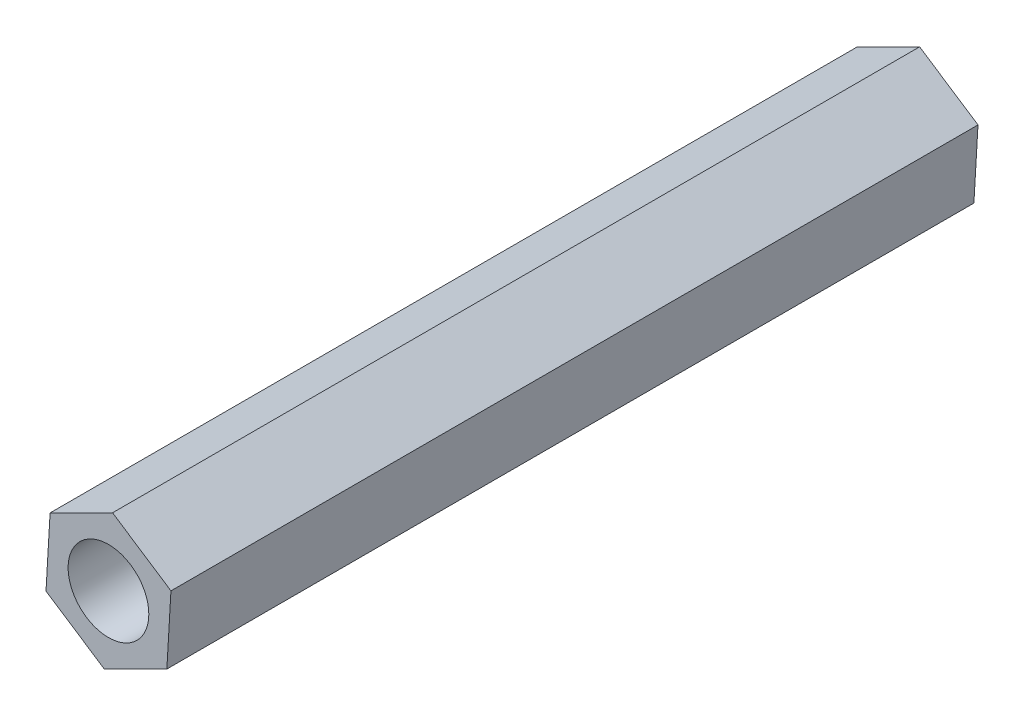
ISO-10303-21;
HEADER;
FILE_DESCRIPTION(('STEP AP214'),'2;1');
FILE_NAME('part.step','',(''),(''),'','','');
FILE_SCHEMA(('AUTOMOTIVE_DESIGN { 1 0 10303 214 1 1 1 1 }'));
ENDSEC;
DATA;
#1=APPLICATION_CONTEXT('core data for automotive mechanical design processes');
#2=APPLICATION_PROTOCOL_DEFINITION('international standard','automotive_design',2000,#1);
#3=PRODUCT_CONTEXT('',#1,'mechanical');
#4=PRODUCT('Part','Part','',(#3));
#5=PRODUCT_RELATED_PRODUCT_CATEGORY('part','',(#4));
#6=PRODUCT_DEFINITION_FORMATION('','',#4);
#7=PRODUCT_DEFINITION_CONTEXT('part definition',#1,'design');
#8=PRODUCT_DEFINITION('design','',#6,#7);
#9=PRODUCT_DEFINITION_SHAPE('','',#8);
#10=(LENGTH_UNIT() NAMED_UNIT(*) SI_UNIT(.MILLI.,.METRE.));
#11=(NAMED_UNIT(*) PLANE_ANGLE_UNIT() SI_UNIT($,.RADIAN.));
#12=(NAMED_UNIT(*) SI_UNIT($,.STERADIAN.) SOLID_ANGLE_UNIT());
#13=UNCERTAINTY_MEASURE_WITH_UNIT(LENGTH_MEASURE(1.E-05),#10,'distance_accuracy_value','');
#14=(GEOMETRIC_REPRESENTATION_CONTEXT(3) GLOBAL_UNCERTAINTY_ASSIGNED_CONTEXT((#13)) GLOBAL_UNIT_ASSIGNED_CONTEXT((#10,
#11,#12)) REPRESENTATION_CONTEXT('',''));
#15=CARTESIAN_POINT('',(0.,0.,0.));
#16=DIRECTION('',(0.,0.,1.));
#17=DIRECTION('',(1.,0.,0.));
#18=AXIS2_PLACEMENT_3D('',#15,#16,#17);
#19=CARTESIAN_POINT('',(0.,0.,40.));
#20=DIRECTION('',(0.,0.,1.));
#21=DIRECTION('',(1.,0.,0.));
#22=AXIS2_PLACEMENT_3D('',#19,#20,#21);
#23=PLANE('',#22);
#24=DIRECTION('',(0.058656445682659,0.998278228441288,0.));
#25=VECTOR('',#24,1.);
#26=CARTESIAN_POINT('',(2.89323874121007,-1.90503794879813,40.));
#27=LINE('',#26,#25);
#28=CARTESIAN_POINT('',(2.89323874121007,-1.90503794879813,40.));
#29=VERTEX_POINT('',#28);
#30=CARTESIAN_POINT('',(3.09643062943761,1.55309927470217,40.));
#31=VERTEX_POINT('',#30);
#32=EDGE_CURVE('E132',#29,#31,#27,.T.);
#33=ORIENTED_EDGE('',*,*,#32,.T.);
#34=DIRECTION('',(-0.835206083033751,0.549937086277529,0.));
#35=VECTOR('',#34,1.);
#36=CARTESIAN_POINT('',(3.09643062943761,1.55309927470217,40.));
#37=LINE('',#36,#35);
#38=CARTESIAN_POINT('',(0.203191888227539,3.4581372235003,40.));
#39=VERTEX_POINT('',#38);
#40=EDGE_CURVE('E90',#31,#39,#37,.T.);
#41=ORIENTED_EDGE('',*,*,#40,.T.);
#42=DIRECTION('',(-0.89386252871641,-0.448341142163759,0.));
#43=VECTOR('',#42,1.);
#44=CARTESIAN_POINT('',(0.203191888227539,3.4581372235003,40.));
#45=LINE('',#44,#43);
#46=CARTESIAN_POINT('',(-2.89323874121007,1.90503794879813,40.));
#47=VERTEX_POINT('',#46);
#48=EDGE_CURVE('E103',#39,#47,#45,.T.);
#49=ORIENTED_EDGE('',*,*,#48,.T.);
#50=DIRECTION('',(-0.0586564456826592,-0.998278228441288,0.));
#51=VECTOR('',#50,1.);
#52=CARTESIAN_POINT('',(-2.89323874121007,1.90503794879813,40.));
#53=LINE('',#52,#51);
#54=CARTESIAN_POINT('',(-3.09643062943761,-1.55309927470217,40.));
#55=VERTEX_POINT('',#54);
#56=EDGE_CURVE('E97',#47,#55,#53,.T.);
#57=ORIENTED_EDGE('',*,*,#56,.T.);
#58=DIRECTION('',(0.835206083033751,-0.549937086277529,0.));
#59=VECTOR('',#58,1.);
#60=CARTESIAN_POINT('',(-3.09643062943761,-1.55309927470217,40.));
#61=LINE('',#60,#59);
#62=CARTESIAN_POINT('',(-0.203191888227537,-3.4581372235003,40.));
#63=VERTEX_POINT('',#62);
#64=EDGE_CURVE('E101',#55,#63,#61,.T.);
#65=ORIENTED_EDGE('',*,*,#64,.T.);
#66=DIRECTION('',(0.89386252871641,0.448341142163759,0.));
#67=VECTOR('',#66,1.);
#68=CARTESIAN_POINT('',(-0.203191888227537,-3.4581372235003,40.));
#69=LINE('',#68,#67);
#70=EDGE_CURVE('E53',#63,#29,#69,.T.);
#71=ORIENTED_EDGE('',*,*,#70,.T.);
#72=EDGE_LOOP('',(#33,#41,#49,#57,#65,#71));
#73=FACE_BOUND('',#72,.T.);
#74=CARTESIAN_POINT('',(0.,0.,40.));
#75=DIRECTION('',(0.,0.,1.));
#76=DIRECTION('',(1.,0.,0.));
#77=AXIS2_PLACEMENT_3D('',#74,#75,#76);
#78=CIRCLE('',#77,2.);
#79=CARTESIAN_POINT('',(2.,0.,40.));
#80=VERTEX_POINT('',#79);
#81=EDGE_CURVE('E125',#80,#80,#78,.T.);
#82=ORIENTED_EDGE('',*,*,#81,.F.);
#83=EDGE_LOOP('',(#82));
#84=FACE_BOUND('',#83,.T.);
#85=ADVANCED_FACE('F36',(#73,#84),#23,.T.);
#86=CARTESIAN_POINT('',(0.,0.,0.));
#87=DIRECTION('',(0.,0.,1.));
#88=DIRECTION('',(1.,0.,0.));
#89=AXIS2_PLACEMENT_3D('',#86,#87,#88);
#90=PLANE('',#89);
#91=DIRECTION('',(0.058656445682659,0.998278228441288,0.));
#92=VECTOR('',#91,1.);
#93=CARTESIAN_POINT('',(2.89323874121007,-1.90503794879813,0.));
#94=LINE('',#93,#92);
#95=CARTESIAN_POINT('',(2.89323874121007,-1.90503794879813,0.));
#96=VERTEX_POINT('',#95);
#97=CARTESIAN_POINT('',(3.09643062943761,1.55309927470217,0.));
#98=VERTEX_POINT('',#97);
#99=EDGE_CURVE('E121',#96,#98,#94,.T.);
#100=ORIENTED_EDGE('',*,*,#99,.F.);
#101=DIRECTION('',(0.89386252871641,0.448341142163759,0.));
#102=VECTOR('',#101,1.);
#103=CARTESIAN_POINT('',(-0.203191888227537,-3.4581372235003,0.));
#104=LINE('',#103,#102);
#105=CARTESIAN_POINT('',(-0.203191888227537,-3.4581372235003,0.));
#106=VERTEX_POINT('',#105);
#107=EDGE_CURVE('E82',#106,#96,#104,.T.);
#108=ORIENTED_EDGE('',*,*,#107,.F.);
#109=DIRECTION('',(0.835206083033751,-0.549937086277529,0.));
#110=VECTOR('',#109,1.);
#111=CARTESIAN_POINT('',(-3.09643062943761,-1.55309927470217,0.));
#112=LINE('',#111,#110);
#113=CARTESIAN_POINT('',(-3.09643062943761,-1.55309927470217,0.));
#114=VERTEX_POINT('',#113);
#115=EDGE_CURVE('E76',#114,#106,#112,.T.);
#116=ORIENTED_EDGE('',*,*,#115,.F.);
#117=DIRECTION('',(-0.0586564456826592,-0.998278228441288,0.));
#118=VECTOR('',#117,1.);
#119=CARTESIAN_POINT('',(-2.89323874121007,1.90503794879813,0.));
#120=LINE('',#119,#118);
#121=CARTESIAN_POINT('',(-2.89323874121007,1.90503794879813,0.));
#122=VERTEX_POINT('',#121);
#123=EDGE_CURVE('E111',#122,#114,#120,.T.);
#124=ORIENTED_EDGE('',*,*,#123,.F.);
#125=DIRECTION('',(-0.89386252871641,-0.448341142163759,0.));
#126=VECTOR('',#125,1.);
#127=CARTESIAN_POINT('',(0.203191888227539,3.4581372235003,0.));
#128=LINE('',#127,#126);
#129=CARTESIAN_POINT('',(0.203191888227539,3.4581372235003,0.));
#130=VERTEX_POINT('',#129);
#131=EDGE_CURVE('E127',#130,#122,#128,.T.);
#132=ORIENTED_EDGE('',*,*,#131,.F.);
#133=DIRECTION('',(-0.835206083033751,0.549937086277529,0.));
#134=VECTOR('',#133,1.);
#135=CARTESIAN_POINT('',(3.09643062943761,1.55309927470217,0.));
#136=LINE('',#135,#134);
#137=EDGE_CURVE('E124',#98,#130,#136,.T.);
#138=ORIENTED_EDGE('',*,*,#137,.F.);
#139=EDGE_LOOP('',(#100,#108,#116,#124,#132,#138));
#140=FACE_BOUND('',#139,.T.);
#141=CARTESIAN_POINT('',(0.,0.,0.));
#142=DIRECTION('',(0.,0.,1.));
#143=DIRECTION('',(1.,0.,0.));
#144=AXIS2_PLACEMENT_3D('',#141,#142,#143);
#145=CIRCLE('',#144,2.);
#146=CARTESIAN_POINT('',(2.,0.,0.));
#147=VERTEX_POINT('',#146);
#148=EDGE_CURVE('E225',#147,#147,#145,.T.);
#149=ORIENTED_EDGE('',*,*,#148,.T.);
#150=EDGE_LOOP('',(#149));
#151=FACE_BOUND('',#150,.T.);
#152=ADVANCED_FACE('F141',(#140,#151),#90,.F.);
#153=CARTESIAN_POINT('',(2.89323874121007,-1.90503794879813,40.));
#154=DIRECTION('',(-0.998278228441288,0.058656445682659,0.));
#155=DIRECTION('',(-0.058656445682659,-0.998278228441288,0.));
#156=AXIS2_PLACEMENT_3D('',#153,#154,#155);
#157=PLANE('',#156);
#158=ORIENTED_EDGE('',*,*,#99,.T.);
#159=DIRECTION('',(0.,0.,-1.));
#160=VECTOR('',#159,1.);
#161=CARTESIAN_POINT('',(3.09643062943761,1.55309927470217,40.));
#162=LINE('',#161,#160);
#163=EDGE_CURVE('E11',#31,#98,#162,.T.);
#164=ORIENTED_EDGE('',*,*,#163,.F.);
#165=ORIENTED_EDGE('',*,*,#32,.F.);
#166=DIRECTION('',(0.,0.,-1.));
#167=VECTOR('',#166,1.);
#168=CARTESIAN_POINT('',(2.89323874121007,-1.90503794879813,40.));
#169=LINE('',#168,#167);
#170=EDGE_CURVE('E117',#29,#96,#169,.T.);
#171=ORIENTED_EDGE('',*,*,#170,.T.);
#172=EDGE_LOOP('',(#158,#164,#165,#171));
#173=FACE_BOUND('',#172,.T.);
#174=ADVANCED_FACE('F38',(#173),#157,.F.);
#175=CARTESIAN_POINT('',(3.09643062943761,1.55309927470217,40.));
#176=DIRECTION('',(-0.549937086277529,-0.835206083033751,0.));
#177=DIRECTION('',(0.835206083033751,-0.549937086277529,0.));
#178=AXIS2_PLACEMENT_3D('',#175,#176,#177);
#179=PLANE('',#178);
#180=ORIENTED_EDGE('',*,*,#137,.T.);
#181=DIRECTION('',(0.,0.,-1.));
#182=VECTOR('',#181,1.);
#183=CARTESIAN_POINT('',(0.203191888227539,3.4581372235003,40.));
#184=LINE('',#183,#182);
#185=EDGE_CURVE('E45',#39,#130,#184,.T.);
#186=ORIENTED_EDGE('',*,*,#185,.F.);
#187=ORIENTED_EDGE('',*,*,#40,.F.);
#188=ORIENTED_EDGE('',*,*,#163,.T.);
#189=EDGE_LOOP('',(#180,#186,#187,#188));
#190=FACE_BOUND('',#189,.T.);
#191=ADVANCED_FACE('F166',(#190),#179,.F.);
#192=CARTESIAN_POINT('',(0.203191888227539,3.4581372235003,40.));
#193=DIRECTION('',(0.448341142163759,-0.893862528716411,0.));
#194=DIRECTION('',(0.893862528716411,0.448341142163759,0.));
#195=AXIS2_PLACEMENT_3D('',#192,#193,#194);
#196=PLANE('',#195);
#197=ORIENTED_EDGE('',*,*,#131,.T.);
#198=DIRECTION('',(0.,0.,-1.));
#199=VECTOR('',#198,1.);
#200=CARTESIAN_POINT('',(-2.89323874121007,1.90503794879813,40.));
#201=LINE('',#200,#199);
#202=EDGE_CURVE('E112',#47,#122,#201,.T.);
#203=ORIENTED_EDGE('',*,*,#202,.F.);
#204=ORIENTED_EDGE('',*,*,#48,.F.);
#205=ORIENTED_EDGE('',*,*,#185,.T.);
#206=EDGE_LOOP('',(#197,#203,#204,#205));
#207=FACE_BOUND('',#206,.T.);
#208=ADVANCED_FACE('F138',(#207),#196,.F.);
#209=CARTESIAN_POINT('',(-2.89323874121007,1.90503794879813,40.));
#210=DIRECTION('',(0.998278228441288,-0.0586564456826592,0.));
#211=DIRECTION('',(0.0586564456826592,0.998278228441288,0.));
#212=AXIS2_PLACEMENT_3D('',#209,#210,#211);
#213=PLANE('',#212);
#214=ORIENTED_EDGE('',*,*,#123,.T.);
#215=DIRECTION('',(0.,0.,-1.));
#216=VECTOR('',#215,1.);
#217=CARTESIAN_POINT('',(-3.09643062943761,-1.55309927470217,40.));
#218=LINE('',#217,#216);
#219=EDGE_CURVE('E108',#55,#114,#218,.T.);
#220=ORIENTED_EDGE('',*,*,#219,.F.);
#221=ORIENTED_EDGE('',*,*,#56,.F.);
#222=ORIENTED_EDGE('',*,*,#202,.T.);
#223=EDGE_LOOP('',(#214,#220,#221,#222));
#224=FACE_BOUND('',#223,.T.);
#225=ADVANCED_FACE('F109',(#224),#213,.F.);
#226=CARTESIAN_POINT('',(-3.09643062943761,-1.55309927470217,40.));
#227=DIRECTION('',(0.549937086277529,0.835206083033751,0.));
#228=DIRECTION('',(-0.835206083033751,0.549937086277529,0.));
#229=AXIS2_PLACEMENT_3D('',#226,#227,#228);
#230=PLANE('',#229);
#231=ORIENTED_EDGE('',*,*,#115,.T.);
#232=DIRECTION('',(0.,0.,-1.));
#233=VECTOR('',#232,1.);
#234=CARTESIAN_POINT('',(-0.203191888227537,-3.4581372235003,40.));
#235=LINE('',#234,#233);
#236=EDGE_CURVE('E113',#63,#106,#235,.T.);
#237=ORIENTED_EDGE('',*,*,#236,.F.);
#238=ORIENTED_EDGE('',*,*,#64,.F.);
#239=ORIENTED_EDGE('',*,*,#219,.T.);
#240=EDGE_LOOP('',(#231,#237,#238,#239));
#241=FACE_BOUND('',#240,.T.);
#242=ADVANCED_FACE('F115',(#241),#230,.F.);
#243=CARTESIAN_POINT('',(-0.203191888227537,-3.4581372235003,40.));
#244=DIRECTION('',(-0.448341142163759,0.893862528716411,0.));
#245=DIRECTION('',(-0.893862528716411,-0.448341142163759,0.));
#246=AXIS2_PLACEMENT_3D('',#243,#244,#245);
#247=PLANE('',#246);
#248=ORIENTED_EDGE('',*,*,#107,.T.);
#249=ORIENTED_EDGE('',*,*,#170,.F.);
#250=ORIENTED_EDGE('',*,*,#70,.F.);
#251=ORIENTED_EDGE('',*,*,#236,.T.);
#252=EDGE_LOOP('',(#248,#249,#250,#251));
#253=FACE_BOUND('',#252,.T.);
#254=ADVANCED_FACE('F146',(#253),#247,.F.);
#255=CARTESIAN_POINT('',(0.,0.,40.));
#256=DIRECTION('',(0.,0.,-1.));
#257=DIRECTION('',(-1.,0.,0.));
#258=AXIS2_PLACEMENT_3D('',#255,#256,#257);
#259=CYLINDRICAL_SURFACE('',#258,2.);
#260=ORIENTED_EDGE('',*,*,#81,.T.);
#261=EDGE_LOOP('',(#260));
#262=FACE_BOUND('',#261,.T.);
#263=ORIENTED_EDGE('',*,*,#148,.F.);
#264=EDGE_LOOP('',(#263));
#265=FACE_BOUND('',#264,.T.);
#266=ADVANCED_FACE('F148',(#262,#265),#259,.F.);
#267=CLOSED_SHELL('',(#85,#152,#174,#191,#208,#225,#242,#254,#266));
#268=MANIFOLD_SOLID_BREP('B2',#267);
#269=ADVANCED_BREP_SHAPE_REPRESENTATION('',(#18,#268),#14);
#270=SHAPE_DEFINITION_REPRESENTATION(#9,#269);
ENDSEC;
END-ISO-10303-21;
